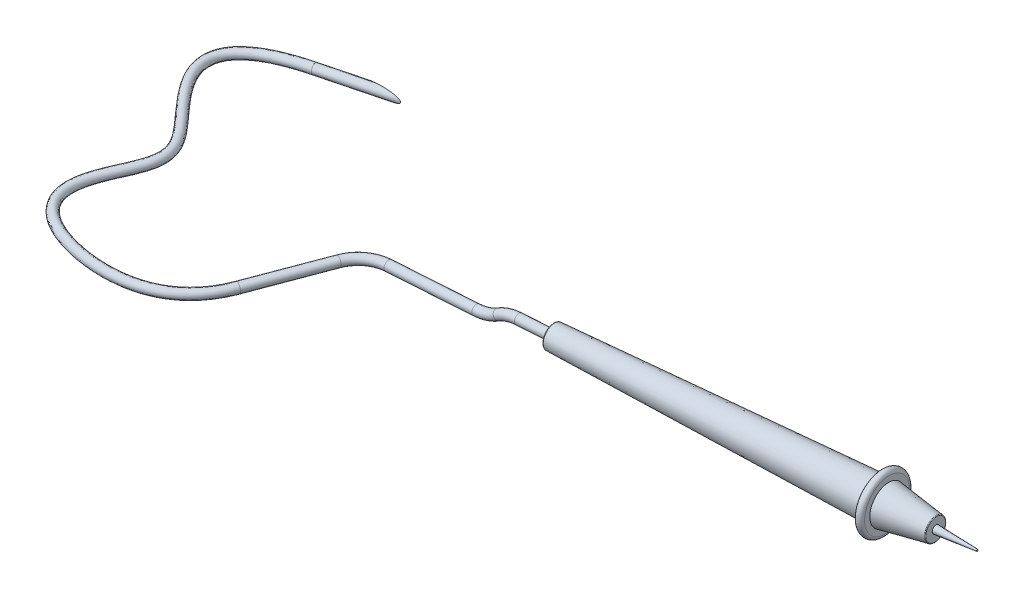
ISO-10303-21;
HEADER;
FILE_DESCRIPTION(('STEP AP214'),'2;1');
FILE_NAME('part.step','',(''),(''),'','','');
FILE_SCHEMA(('AUTOMOTIVE_DESIGN { 1 0 10303 214 1 1 1 1 }'));
ENDSEC;
DATA;
#1=APPLICATION_CONTEXT('core data for automotive mechanical design processes');
#2=APPLICATION_PROTOCOL_DEFINITION('international standard','automotive_design',2000,#1);
#3=PRODUCT_CONTEXT('',#1,'mechanical');
#4=PRODUCT('Part','Part','',(#3));
#5=PRODUCT_RELATED_PRODUCT_CATEGORY('part','',(#4));
#6=PRODUCT_DEFINITION_FORMATION('','',#4);
#7=PRODUCT_DEFINITION_CONTEXT('part definition',#1,'design');
#8=PRODUCT_DEFINITION('design','',#6,#7);
#9=PRODUCT_DEFINITION_SHAPE('','',#8);
#10=(LENGTH_UNIT() NAMED_UNIT(*) SI_UNIT(.MILLI.,.METRE.));
#11=(NAMED_UNIT(*) PLANE_ANGLE_UNIT() SI_UNIT($,.RADIAN.));
#12=(NAMED_UNIT(*) SI_UNIT($,.STERADIAN.) SOLID_ANGLE_UNIT());
#13=UNCERTAINTY_MEASURE_WITH_UNIT(LENGTH_MEASURE(1.E-05),#10,'distance_accuracy_value','');
#14=(GEOMETRIC_REPRESENTATION_CONTEXT(3) GLOBAL_UNCERTAINTY_ASSIGNED_CONTEXT((#13)) GLOBAL_UNIT_ASSIGNED_CONTEXT((#10,
#11,#12)) REPRESENTATION_CONTEXT('',''));
#15=CARTESIAN_POINT('',(0.,0.,0.));
#16=DIRECTION('',(0.,0.,1.));
#17=DIRECTION('',(1.,0.,0.));
#18=AXIS2_PLACEMENT_3D('',#15,#16,#17);
#19=CARTESIAN_POINT('',(-114.413181411453,1.84392445554634,46.2386150736062));
#20=DIRECTION('',(-0.968172758552491,0.,0.250282859175096));
#21=DIRECTION('',(-0.0433734577551862,0.984869477601442,-0.167782166070835));
#22=AXIS2_PLACEMENT_3D('',#19,#20,#21);
#23=CYLINDRICAL_SURFACE('',#22,1.25);
#24=CARTESIAN_POINT('',(-128.963400440303,1.84392445554635,50.));
#25=DIRECTION('',(0.,0.,1.));
#26=DIRECTION('',(-1.,0.,0.));
#27=AXIS2_PLACEMENT_3D('',#24,#25,#26);
#28=ELLIPSE('',#27,4.99434921000926,1.25);
#29=CARTESIAN_POINT('',(-133.957749650313,1.84392445554636,50.));
#30=VERTEX_POINT('',#29);
#31=EDGE_CURVE('P0_E44',#30,#30,#28,.F.);
#32=ORIENTED_EDGE('',*,*,#31,.F.);
#33=EDGE_LOOP('',(#32));
#34=FACE_BOUND('',#33,.T.);
#35=CARTESIAN_POINT('',(-143.104581010013,1.84392445554637,53.6556441748989));
#36=DIRECTION('',(-0.968172758552389,-2.30426060928425E-12,0.250282859175489));
#37=DIRECTION('',(-0.0433734577574522,0.984869477601442,-0.167782166070249));
#38=AXIS2_PLACEMENT_3D('',#35,#36,#37);
#39=CIRCLE('',#38,1.25);
#40=CARTESIAN_POINT('',(-143.050364187816,0.612837608544567,53.8653718824867));
#41=VERTEX_POINT('',#40);
#42=EDGE_CURVE('P0_E11',#41,#41,#39,.T.);
#43=ORIENTED_EDGE('',*,*,#42,.F.);
#44=EDGE_LOOP('',(#43));
#45=FACE_BOUND('',#44,.T.);
#46=ADVANCED_FACE('P0_F40',(#34,#45),#23,.T.);
#47=CARTESIAN_POINT('',(-143.104581010013,1.84392445554637,53.6556441748989));
#48=DIRECTION('',(0.968172758552389,2.30430844661795E-12,-0.250282859175489));
#49=DIRECTION('',(-0.0433734577574523,0.984869477601442,-0.167782166070249));
#50=AXIS2_PLACEMENT_3D('',#47,#48,#49);
#51=PLANE('',#50);
#52=ORIENTED_EDGE('',*,*,#42,.T.);
#53=EDGE_LOOP('',(#52));
#54=FACE_BOUND('',#53,.T.);
#55=ADVANCED_FACE('P0_F42',(#54),#51,.F.);
#56=CARTESIAN_POINT('',(0.,0.,50.));
#57=DIRECTION('',(0.,0.,1.));
#58=DIRECTION('',(1.,0.,0.));
#59=AXIS2_PLACEMENT_3D('',#56,#57,#58);
#60=PLANE('',#59);
#61=ORIENTED_EDGE('',*,*,#31,.T.);
#62=EDGE_LOOP('',(#61));
#63=FACE_BOUND('',#62,.T.);
#64=ADVANCED_FACE('P0_F52',(#63),#60,.F.);
#65=CLOSED_SHELL('',(#46,#55,#64));
#66=MANIFOLD_SOLID_BREP('P0_B2',#65);
#67=CARTESIAN_POINT('',(-58.2438068953792,2.11679684586519,84.3713220977987));
#68=DIRECTION('',(0.997004276211552,-0.00938755554240006,-0.0767746508739621));
#69=DIRECTION('',(0.0133912818415065,0.998567603527678,0.0518016868029478));
#70=AXIS2_PLACEMENT_3D('',#67,#68,#69);
#71=CYLINDRICAL_SURFACE('',#70,1.25);
#72=CARTESIAN_POINT('',(-49.8079475316261,2.03736679705334,83.7217158995836));
#73=DIRECTION('',(0.997004276211552,-0.00938755554240027,-0.0767746508739621));
#74=DIRECTION('',(0.0133912818415067,0.998567603527678,0.0518016868029478));
#75=AXIS2_PLACEMENT_3D('',#72,#73,#74);
#76=CIRCLE('',#75,1.25);
#77=CARTESIAN_POINT('',(-49.824686633928,0.789157292643739,83.6569637910799));
#78=VERTEX_POINT('',#77);
#79=EDGE_CURVE('P1_E41',#78,#78,#76,.T.);
#80=ORIENTED_EDGE('',*,*,#79,.F.);
#81=EDGE_LOOP('',(#80));
#82=FACE_BOUND('',#81,.T.);
#83=CARTESIAN_POINT('',(-58.2438068953792,2.11679684586519,84.3713220977987));
#84=DIRECTION('',(0.997004276211552,-0.00938755554240027,-0.0767746508739621));
#85=DIRECTION('',(0.0133912818415067,0.998567603527678,0.0518016868029478));
#86=AXIS2_PLACEMENT_3D('',#83,#84,#85);
#87=CIRCLE('',#86,1.25);
#88=CARTESIAN_POINT('',(-58.260545997681,0.868587341455588,84.306569989295));
#89=VERTEX_POINT('',#88);
#90=EDGE_CURVE('P1_E11',#89,#89,#87,.T.);
#91=ORIENTED_EDGE('',*,*,#90,.T.);
#92=EDGE_LOOP('',(#91));
#93=FACE_BOUND('',#92,.T.);
#94=ADVANCED_FACE('P1_F16',(#82,#93),#71,.T.);
#95=CARTESIAN_POINT('',(-58.3744194228826,-7.62278149498767,83.8660717922377));
#96=DIRECTION('',(-0.0761783879228338,0.052674614245647,-0.995701882205487));
#97=DIRECTION('',(0.0133912818415064,0.998567603527678,0.0518016868029479));
#98=AXIS2_PLACEMENT_3D('',#95,#96,#97);
#99=TOROIDAL_SURFACE('',#98,9.75354929044911,1.25);
#100=ORIENTED_EDGE('',*,*,#90,.F.);
#101=EDGE_LOOP('',(#100));
#102=FACE_BOUND('',#101,.T.);
#103=CARTESIAN_POINT('',(-63.3407344520195,0.731373282880699,84.6879822131526));
#104=DIRECTION('',(0.857281918810159,0.513411157712895,-0.0384277870437101));
#105=DIRECTION('',(-0.509180287221187,0.856524587008439,0.0842678287092573));
#106=AXIS2_PLACEMENT_3D('',#103,#104,#105);
#107=CIRCLE('',#106,1.25);
#108=CARTESIAN_POINT('',(-62.704259092993,-0.339282450879845,84.582647427266));
#109=VERTEX_POINT('',#108);
#110=EDGE_CURVE('P1_E29',#109,#109,#107,.T.);
#111=ORIENTED_EDGE('',*,*,#110,.T.);
#112=EDGE_LOOP('',(#111));
#113=FACE_BOUND('',#112,.T.);
#114=ADVANCED_FACE('P1_F18',(#102,#113),#99,.T.);
#115=CARTESIAN_POINT('',(-68.7548621074316,9.83882219723435,85.5840042967375));
#116=DIRECTION('',(0.0761783879228338,-0.052674614245647,0.995701882205487));
#117=DIRECTION('',(-0.0133912818415064,-0.998567603527678,-0.0518016868029479));
#118=AXIS2_PLACEMENT_3D('',#115,#116,#117);
#119=TOROIDAL_SURFACE('',#118,10.6330268301614,1.25);
#120=ORIENTED_EDGE('',*,*,#110,.F.);
#121=EDGE_LOOP('',(#120));
#122=FACE_BOUND('',#121,.T.);
#123=CARTESIAN_POINT('',(-68.8972519665426,-0.778973922805424,85.0331955711142));
#124=DIRECTION('',(0.997004276211552,-0.00938755554239999,-0.0767746508739621));
#125=DIRECTION('',(0.0133912818415064,0.998567603527678,0.0518016868029478));
#126=AXIS2_PLACEMENT_3D('',#123,#124,#125);
#127=CIRCLE('',#126,1.25);
#128=CARTESIAN_POINT('',(-68.9139910688445,-2.02718342721502,84.9684434626105));
#129=VERTEX_POINT('',#128);
#130=EDGE_CURVE('P1_E82',#129,#129,#127,.T.);
#131=ORIENTED_EDGE('',*,*,#130,.T.);
#132=EDGE_LOOP('',(#131));
#133=FACE_BOUND('',#132,.T.);
#134=ADVANCED_FACE('P1_F179',(#122,#133),#119,.T.);
#135=CARTESIAN_POINT('',(-49.8079475316261,2.03736679705334,83.7217158995836));
#136=DIRECTION('',(-0.997004276211552,0.00938755554240021,0.0767746508739621));
#137=DIRECTION('',(-0.0761783879228338,0.052674614245647,-0.995701882205487));
#138=AXIS2_PLACEMENT_3D('',#135,#136,#137);
#139=PLANE('',#138);
#140=ORIENTED_EDGE('',*,*,#79,.T.);
#141=EDGE_LOOP('',(#140));
#142=FACE_BOUND('',#141,.T.);
#143=ADVANCED_FACE('P1_F125',(#142),#139,.F.);
#144=CARTESIAN_POINT('',(-105.259920768685,-1.64879020422453,111.20345233921));
#145=CARTESIAN_POINT('',(-106.750688929774,-1.80611365168269,114.621514673474));
#146=CARTESIAN_POINT('',(-110.640430291664,-2.02501234830117,119.846706872232));
#147=CARTESIAN_POINT('',(-117.859534925365,-2.14078848651006,123.944707898293));
#148=CARTESIAN_POINT('',(-125.291825774411,-2.12039383053202,125.472890929166));
#149=CARTESIAN_POINT('',(-133.033123922986,-2.01230013553817,125.390404104827));
#150=CARTESIAN_POINT('',(-142.834844960721,-1.78205480638048,123.485873119425));
#151=CARTESIAN_POINT('',(-148.981271558803,-1.51249239346335,119.878504840365));
#152=CARTESIAN_POINT('',(-151.796055108792,-1.24593195233411,115.467739956934));
#153=CARTESIAN_POINT('',(-152.837293929922,-1.02075470408737,111.396228088316));
#154=CARTESIAN_POINT('',(-151.952367733216,-0.767819311691482,106.291695763973));
#155=CARTESIAN_POINT('',(-149.272820472082,-0.511082386092837,100.64995382176));
#156=CARTESIAN_POINT('',(-147.220348302442,-0.333998327474796,96.7057649363695));
#157=CARTESIAN_POINT('',(-146.025960211018,-0.163749915276623,93.1151687992));
#158=CARTESIAN_POINT('',(-145.91141669945,-0.0280019114081995,90.4687792351968));
#159=CARTESIAN_POINT('',(-147.580324466714,0.174216825129343,87.002091643789));
#160=CARTESIAN_POINT('',(-150.468601260601,0.398085075846043,83.4332917561691));
#161=CARTESIAN_POINT('',(-154.419184865753,0.673932366147242,79.1371229853099));
#162=CARTESIAN_POINT('',(-158.455370234701,0.985889364545348,74.1670057489098));
#163=CARTESIAN_POINT('',(-160.753449080808,1.26160537531215,69.4461777277364));
#164=CARTESIAN_POINT('',(-161.158512240234,1.46245178941384,65.679226890451));
#165=CARTESIAN_POINT('',(-160.292664263156,1.65774944641164,61.6906940768042));
#166=CARTESIAN_POINT('',(-156.231714180668,1.84852647005168,56.9633367740429));
#167=CARTESIAN_POINT('',(-148.738566025946,1.91099623696341,53.8220656243791));
#168=CARTESIAN_POINT('',(-143.417175582341,1.91099623697504,52.4464301262206));
#169=CARTESIAN_POINT('',(-105.2548794718,-1.27656707106977,111.222783417744));
#170=CARTESIAN_POINT('',(-106.745646087723,-1.43389035546381,114.640842209222));
#171=CARTESIAN_POINT('',(-110.635405745571,-1.6527898276703,119.866054088486));
#172=CARTESIAN_POINT('',(-117.854520070999,-1.76856611507036,123.964060495879));
#173=CARTESIAN_POINT('',(-125.286826252182,-1.74817167963204,125.492251741558));
#174=CARTESIAN_POINT('',(-133.028134147651,-1.64007786029896,125.409765040039));
#175=CARTESIAN_POINT('',(-142.829872645672,-1.40983226970072,123.505233528584));
#176=CARTESIAN_POINT('',(-148.976315947282,-1.14026890641912,119.897851247634));
#177=CARTESIAN_POINT('',(-151.79111184574,-0.873707355557576,115.487068164392));
#178=CARTESIAN_POINT('',(-152.832351077607,-0.648529898137863,111.415552369781));
#179=CARTESIAN_POINT('',(-151.947429320353,-0.395592759320405,106.31098752777));
#180=CARTESIAN_POINT('',(-149.267876091643,-0.138855592041411,100.669239384067));
#181=CARTESIAN_POINT('',(-147.215407971626,0.0382280307750147,96.7250599463803));
#182=CARTESIAN_POINT('',(-146.021020390592,0.208476225744522,93.1344681286125));
#183=CARTESIAN_POINT('',(-145.906475898889,0.344223216824249,90.4880978344975));
#184=CARTESIAN_POINT('',(-147.575378859627,0.546441006019273,87.0214272622267));
#185=CARTESIAN_POINT('',(-150.463651315557,0.770308786035715,83.4526353267654));
#186=CARTESIAN_POINT('',(-154.414236199442,1.04615629414252,79.1564626878902));
#187=CARTESIAN_POINT('',(-158.450423443693,1.35811351518801,74.18634164436));
#188=CARTESIAN_POINT('',(-160.748504835859,1.63383104401761,69.4654850180694));
#189=CARTESIAN_POINT('',(-161.153565389661,1.83467764272383,65.6985299486292));
#190=CARTESIAN_POINT('',(-160.287714531228,2.02997545919127,61.7099933160672));
#191=CARTESIAN_POINT('',(-156.226754639769,2.22075366451408,56.9826106985931));
#192=CARTESIAN_POINT('',(-148.733585750023,2.2832240462415,53.8413223370656));
#193=CARTESIAN_POINT('',(-143.412197380603,2.28322404625313,52.4656873751054));
#194=CARTESIAN_POINT('',(-105.573997849595,-0.520333175502154,111.118409021138));
#195=CARTESIAN_POINT('',(-107.045894058565,-0.675665031883269,114.493201375271));
#196=CARTESIAN_POINT('',(-110.872566026124,-0.89077080803716,119.628974332695));
#197=CARTESIAN_POINT('',(-117.967151664148,-1.0047137114456,123.659447097361));
#198=CARTESIAN_POINT('',(-125.308692292298,-0.984687072078076,125.171264400152));
#199=CARTESIAN_POINT('',(-132.97777439733,-0.877642516464973,125.090332953825));
#200=CARTESIAN_POINT('',(-142.705801316868,-0.649107622269081,123.199722870974));
#201=CARTESIAN_POINT('',(-148.732927561694,-0.383684260020333,119.641301593625));
#202=CARTESIAN_POINT('',(-151.445593240534,-0.12617457141549,115.378607159984));
#203=CARTESIAN_POINT('',(-152.452110229825,0.090840567935182,111.455458176017));
#204=CARTESIAN_POINT('',(-151.597654742651,0.337704825688736,106.475834529925));
#205=CARTESIAN_POINT('',(-148.942008457675,0.592500526815453,100.877691719637));
#206=CARTESIAN_POINT('',(-146.880716886654,0.770372292857698,96.9160384955296));
#207=CARTESIAN_POINT('',(-145.653449358239,0.944185630202624,93.2482225453587));
#208=CARTESIAN_POINT('',(-145.53038613442,1.08826711283225,90.4389882497608));
#209=CARTESIAN_POINT('',(-147.271921288984,1.29780812858802,86.8499259367986));
#210=CARTESIAN_POINT('',(-150.187296939239,1.52362096628664,83.2506460930878));
#211=CARTESIAN_POINT('',(-154.136622539198,1.79936586474019,78.9561258955685));
#212=CARTESIAN_POINT('',(-158.143919233729,2.10925549181917,74.0183928100742));
#213=CARTESIAN_POINT('',(-160.391896868028,2.37967343290763,69.386742604899));
#214=CARTESIAN_POINT('',(-160.777970276573,2.57337981059822,65.7525193362764));
#215=CARTESIAN_POINT('',(-159.950482492561,2.76015418720965,61.9382040893427));
#216=CARTESIAN_POINT('',(-156.036158069371,2.94583249353278,57.3470377080839));
#217=CARTESIAN_POINT('',(-148.608544511739,3.00841761516553,54.2204842794003));
#218=CARTESIAN_POINT('',(-143.312487206783,3.0084176151771,52.8513976645035));
#219=CARTESIAN_POINT('',(-106.68016984388,-0.202188919487146,110.650601742554));
#220=CARTESIAN_POINT('',(-108.088414204357,-0.350803481721973,113.879451896204));
#221=CARTESIAN_POINT('',(-111.702342827736,-0.553115411490692,118.713604818242));
#222=CARTESIAN_POINT('',(-118.376929403051,-0.660874859731917,122.516306547678));
#223=CARTESIAN_POINT('',(-125.412364648173,-0.642089305633732,123.972916460698));
#224=CARTESIAN_POINT('',(-132.837860358373,-0.53858350601432,123.897231040957));
#225=CARTESIAN_POINT('',(-142.317308536771,-0.315817976276195,122.053575268055));
#226=CARTESIAN_POINT('',(-147.942031372927,-0.0643560809573145,118.660260025707));
#227=CARTESIAN_POINT('',(-150.310252388309,0.162625309539789,114.897009056377));
#228=CARTESIAN_POINT('',(-151.199655681185,0.352110269346733,111.474277037481));
#229=CARTESIAN_POINT('',(-150.447970905159,0.578495613965307,106.915987369434));
#230=CARTESIAN_POINT('',(-147.872945637616,0.82674353809073,101.46490573081));
#231=CARTESIAN_POINT('',(-145.781903445845,1.00727255629477,97.4443385010211));
#232=CARTESIAN_POINT('',(-144.443736348039,1.1931102314322,93.5160638207203));
#233=CARTESIAN_POINT('',(-144.291937854654,1.36530063095953,90.1575528966201));
#234=CARTESIAN_POINT('',(-146.278442377415,1.59953982799563,86.1557173486498));
#235=CARTESIAN_POINT('',(-149.285223713342,1.83191199033917,82.4536244476548));
#236=CARTESIAN_POINT('',(-153.23030503394,2.10731133502341,78.1646682090715));
#237=CARTESIAN_POINT('',(-157.140161379982,2.41022772132118,73.3361671103245));
#238=CARTESIAN_POINT('',(-159.219150257796,2.66277442705894,69.0053306730365));
#239=CARTESIAN_POINT('',(-159.541175449123,2.83239799737841,65.8187882608845));
#240=CARTESIAN_POINT('',(-158.843075421134,2.9904240432598,62.5920951843651));
#241=CARTESIAN_POINT('',(-155.423313770128,3.15890381305979,58.4603101927751));
#242=CARTESIAN_POINT('',(-148.216760639643,3.22187746120094,55.3834136895372));
#243=CARTESIAN_POINT('',(-143.006147654012,3.22187746121233,54.0364153314644));
#244=CARTESIAN_POINT('',(-107.578343060504,-0.946231902689048,110.224622547539));
#245=CARTESIAN_POINT('',(-108.935538122043,-1.0894591405169,113.33642587228));
#246=CARTESIAN_POINT('',(-112.379575843183,-1.28154414468901,117.929518429119));
#247=CARTESIAN_POINT('',(-118.71793941829,-1.38435373728979,121.549885894461));
#248=CARTESIAN_POINT('',(-125.508584917694,-1.36656947657068,122.962516750283));
#249=CARTESIAN_POINT('',(-132.739210303109,-1.26589523713174,122.891038545314));
#250=CARTESIAN_POINT('',(-142.020028367069,-1.04774427462992,121.084988603844));
#251=CARTESIAN_POINT('',(-147.322845227502,-0.807439417152266,117.823528583088));
#252=CARTESIAN_POINT('',(-149.415464115945,-0.604884301107646,114.459890480882));
#253=CARTESIAN_POINT('',(-150.2110426541,-0.437451427982937,111.437996096788));
#254=CARTESIAN_POINT('',(-149.54184141481,-0.227420432475867,107.216287813698));
#255=CARTESIAN_POINT('',(-147.031227937693,0.0155886043159948,101.882845966081));
#256=CARTESIAN_POINT('',(-144.916474188911,0.198233171573463,97.8153681617297));
#257=CARTESIAN_POINT('',(-143.489464521477,0.3936985997623,93.6785350570205));
#258=CARTESIAN_POINT('',(-143.31461130407,0.588379760948746,89.8805156982779));
#259=CARTESIAN_POINT('',(-145.497248195111,0.842378901002124,85.5484751670643));
#260=CARTESIAN_POINT('',(-148.577133331867,1.07999206736819,81.7642509014586));
#261=CARTESIAN_POINT('',(-152.518853759461,1.35512132295635,77.4796322736718));
#262=CARTESIAN_POINT('',(-156.35069428838,1.65245732529241,72.7385348701259));
#263=CARTESIAN_POINT('',(-158.294359962611,1.89073197299089,68.6478346987114));
#264=CARTESIAN_POINT('',(-158.56498522172,2.0410649040559,65.8198654832689));
#265=CARTESIAN_POINT('',(-157.9704675797,2.17606126882831,63.0638867001292));
#266=CARTESIAN_POINT('',(-154.946669577441,2.33079750064914,59.2993930802582));
#267=CARTESIAN_POINT('',(-147.916595429138,2.39410161296689,56.2617479816387));
#268=CARTESIAN_POINT('',(-142.774509480869,2.39410161297813,54.9324645847547));
#269=CARTESIAN_POINT('',(-107.598394212266,-2.1858177590921,110.158822829162));
#270=CARTESIAN_POINT('',(-108.955584758566,-2.32904452041866,113.270615801275));
#271=CARTESIAN_POINT('',(-112.39858114815,-2.52108110441582,117.862505779854));
#272=CARTESIAN_POINT('',(-118.736044987448,-2.62387716609383,121.48237982194));
#273=CARTESIAN_POINT('',(-125.525673040689,-2.60608466410751,122.894588792451));
#274=CARTESIAN_POINT('',(-132.755596121521,-2.50541987249996,122.823111157728));
#275=CARTESIAN_POINT('',(-142.035368814028,-2.28728688201898,121.017137418681));
#276=CARTESIAN_POINT('',(-147.336999150051,-2.04703941277345,117.756476926843));
#277=CARTESIAN_POINT('',(-149.428687677092,-1.84456742358397,114.394200731114));
#278=CARTESIAN_POINT('',(-150.224115578929,-1.67717488727923,111.373044968301));
#279=CARTESIAN_POINT('',(-149.554836563193,-1.46724348551521,107.153236421785));
#280=CARTESIAN_POINT('',(-147.044575458688,-1.22425243816647,101.820232444004));
#281=CARTESIAN_POINT('',(-144.929610862673,-1.04158579718495,97.7522746240006));
#282=CARTESIAN_POINT('',(-143.502453239251,-0.846097245178664,93.6149575193127));
#283=CARTESIAN_POINT('',(-143.327610344468,-0.651339938531372,89.8154729928917));
#284=CARTESIAN_POINT('',(-145.51073499733,-0.397271379630211,85.4822203842281));
#285=CARTESIAN_POINT('',(-148.590913438415,-0.159630192587443,81.6975317936064));
#286=CARTESIAN_POINT('',(-152.532573121616,0.115489143950635,77.4130886696949));
#287=CARTESIAN_POINT('',(-156.364221235337,0.412807507438282,72.6722815442726));
#288=CARTESIAN_POINT('',(-158.307584101295,0.650995504664945,68.5831734322704));
#289=CARTESIAN_POINT('',(-158.578250784435,0.801293078887071,65.7558964900139));
#290=CARTESIAN_POINT('',(-157.984005756726,0.936249901090788,63.0007504323275));
#291=CARTESIAN_POINT('',(-154.961197086536,1.09091495895757,59.237884566966));
#292=CARTESIAN_POINT('',(-147.932280385038,1.15419261716451,56.2010486295343));
#293=CARTESIAN_POINT('',(-142.79020049789,1.15419261717574,54.8717667995138));
#294=CARTESIAN_POINT('',(-106.716088338112,-2.99082892466173,110.506583126511));
#295=CARTESIAN_POINT('',(-108.124312703031,-3.13944137672921,113.735387433952));
#296=CARTESIAN_POINT('',(-111.738734472039,-3.3417752131119,118.570090127415));
#297=CARTESIAN_POINT('',(-118.413663800591,-3.44953986280483,122.372980729202));
#298=CARTESIAN_POINT('',(-125.449546215599,-3.43075924353667,123.82980136778));
#299=CARTESIAN_POINT('',(-132.875339195623,-3.32724953726593,123.754117487922));
#300=CARTESIAN_POINT('',(-142.355270079657,-3.10447623664281,121.91043670219));
#301=CARTESIAN_POINT('',(-147.980498366249,-2.85298795320442,118.516743447209));
#302=CARTESIAN_POINT('',(-150.349105505094,-2.62597197563978,114.752925568984));
#303=CARTESIAN_POINT('',(-151.238549670785,-2.43647471963492,111.329967085542));
#304=CARTESIAN_POINT('',(-150.486943596432,-2.21004225676059,106.770789476381));
#305=CARTESIAN_POINT('',(-147.911754500637,-1.96178682690375,101.319520800401));
#306=CARTESIAN_POINT('',(-145.820816862041,-1.78126891581206,97.2991947076174));
#307=CARTESIAN_POINT('',(-144.482691367139,-1.59543961563513,93.3710922240347));
#308=CARTESIAN_POINT('',(-144.330877101985,-1.42328084738875,90.0131869707176));
#309=CARTESIAN_POINT('',(-146.317201909978,-1.18907081466656,86.0118671574578));
#310=CARTESIAN_POINT('',(-149.323855454096,-0.956711627607549,82.3099913421085));
#311=CARTESIAN_POINT('',(-153.268968422808,-0.68130699243698,78.0209413015713));
#312=CARTESIAN_POINT('',(-157.178895380339,-0.378383441836236,73.1923203522387));
#313=CARTESIAN_POINT('',(-159.25798986095,-0.125795760338207,68.8607213353442));
#314=CARTESIAN_POINT('',(-159.579969849707,0.0438386052059809,65.6739591411213));
#315=CARTESIAN_POINT('',(-158.881766721435,0.201876084074833,62.4470190213754));
#316=CARTESIAN_POINT('',(-155.461639737784,0.370388622101434,58.3145079228909));
#317=CARTESIAN_POINT('',(-148.254533037054,0.433376842242716,55.2371874152665));
#318=CARTESIAN_POINT('',(-143.043946892857,0.433376842254102,53.8901959959874));
#319=CARTESIAN_POINT('',(-105.604245630907,-2.75367197443067,111.002422549932));
#320=CARTESIAN_POINT('',(-107.076151110872,-2.90900480919657,114.377236160783));
#321=CARTESIAN_POINT('',(-110.902713302681,-3.12410593182242,119.512891035173));
#322=CARTESIAN_POINT('',(-117.997240790349,-3.23804794008377,123.543331511842));
#323=CARTESIAN_POINT('',(-125.338689425673,-3.21801997747792,125.055099525798));
#324=CARTESIAN_POINT('',(-133.007713049339,-3.11097616790025,124.974167342553));
#325=CARTESIAN_POINT('',(-142.735635207161,-2.88244284234766,123.083560416022));
#326=CARTESIAN_POINT('',(-148.762661230816,-2.61702518228567,119.525223150011));
#327=CARTESIAN_POINT('',(-151.475252818848,-2.35952215207472,115.262637915237));
#328=CARTESIAN_POINT('',(-152.481767343715,-2.14250826776187,111.339512487227));
#329=CARTESIAN_POINT('',(-151.627285219827,-1.89565448853772,106.360083947143));
#330=CARTESIAN_POINT('',(-148.971674740311,-1.64086023749311,100.761978345797));
#331=CARTESIAN_POINT('',(-146.910358871553,-1.46298585664116,96.8002684354646));
#332=CARTESIAN_POINT('',(-145.683088280795,-1.28917121592425,93.132426568884));
#333=CARTESIAN_POINT('',(-145.560030937787,-1.14508365656245,90.3230766539567));
#334=CARTESIAN_POINT('',(-147.301594931506,-0.935536956751566,86.7339122261722));
#335=CARTESIAN_POINT('',(-150.216996609502,-0.709721294851381,83.1345846695098));
#336=CARTESIAN_POINT('',(-154.166314537062,-0.433977703231503,78.8400876800865));
#337=CARTESIAN_POINT('',(-158.17359997978,-0.124089412036826,73.902377437373));
#338=CARTESIAN_POINT('',(-160.42156233772,0.146319420674868,69.2708988629012));
#339=CARTESIAN_POINT('',(-160.807651380016,0.340024690738276,65.6367009872078));
#340=CARTESIAN_POINT('',(-159.98018088413,0.526798110531887,61.8224086537646));
#341=CARTESIAN_POINT('',(-156.065915314766,0.712469326758402,57.2313941607828));
#342=CARTESIAN_POINT('',(-148.638426167275,0.775050759497007,54.1049440032816));
#343=CARTESIAN_POINT('',(-143.342356417215,0.775050759508577,52.7358541711944));
#344=CARTESIAN_POINT('',(-105.26496206557,-2.02101333737928,111.184121260676));
#345=CARTESIAN_POINT('',(-106.755731771825,-2.17833694790157,114.602187137726));
#346=CARTESIAN_POINT('',(-110.645454837757,-2.39723486893205,119.827359655979));
#347=CARTESIAN_POINT('',(-117.864549779732,-2.51301085794975,123.925355300707));
#348=CARTESIAN_POINT('',(-125.29682529664,-2.49261598143199,125.453530116774));
#349=CARTESIAN_POINT('',(-133.03811369832,-2.38452241077738,125.371043169615));
#350=CARTESIAN_POINT('',(-142.839817275769,-2.15427734306024,123.466512710266));
#351=CARTESIAN_POINT('',(-148.986227170323,-1.88471588050757,119.859158433096));
#352=CARTESIAN_POINT('',(-151.800998371845,-1.61815654911065,115.448411749476));
#353=CARTESIAN_POINT('',(-152.842236782237,-1.39297951003688,111.376903806851));
#354=CARTESIAN_POINT('',(-151.957306146079,-1.14004586406255,106.272404000176));
#355=CARTESIAN_POINT('',(-149.277764852521,-0.883309180144266,100.630668259453));
#356=CARTESIAN_POINT('',(-147.225288633259,-0.706224685724605,96.6864699263586));
#357=CARTESIAN_POINT('',(-146.030900031444,-0.535976056297769,93.0958694697876));
#358=CARTESIAN_POINT('',(-145.916357500011,-0.40022703964065,90.4494606358961));
#359=CARTESIAN_POINT('',(-147.585270073801,-0.198007355760587,86.9827560253513));
#360=CARTESIAN_POINT('',(-150.473551205645,0.025861365656375,83.4139481855727));
#361=CARTESIAN_POINT('',(-154.424133532063,0.301708438151959,79.1177832827295));
#362=CARTESIAN_POINT('',(-158.46031702571,0.613665213902682,74.1476698534595));
#363=CARTESIAN_POINT('',(-160.758393325757,0.889379706606693,69.4268704374035));
#364=CARTESIAN_POINT('',(-161.163459090808,1.09022593610385,65.659923832273));
#365=CARTESIAN_POINT('',(-160.297613995084,1.28552343363201,61.6713948375412));
#366=CARTESIAN_POINT('',(-156.236673721567,1.47629927558929,56.9440628494926));
#367=CARTESIAN_POINT('',(-148.743546301869,1.53876842768533,53.8028089116926));
#368=CARTESIAN_POINT('',(-143.42215378408,1.53876842769695,52.4271728773358));
#369=CARTESIAN_POINT('',(-105.259920768685,-1.64879020422453,111.20345233921));
#370=CARTESIAN_POINT('',(-106.750688929774,-1.80611365168269,114.621514673474));
#371=CARTESIAN_POINT('',(-110.640430291664,-2.02501234830117,119.846706872232));
#372=CARTESIAN_POINT('',(-117.859534925365,-2.14078848651006,123.944707898293));
#373=CARTESIAN_POINT('',(-125.291825774411,-2.12039383053202,125.472890929166));
#374=CARTESIAN_POINT('',(-133.033123922986,-2.01230013553817,125.390404104827));
#375=CARTESIAN_POINT('',(-142.834844960721,-1.78205480638048,123.485873119425));
#376=CARTESIAN_POINT('',(-148.981271558803,-1.51249239346335,119.878504840365));
#377=CARTESIAN_POINT('',(-151.796055108792,-1.24593195233411,115.467739956934));
#378=CARTESIAN_POINT('',(-152.837293929922,-1.02075470408737,111.396228088316));
#379=CARTESIAN_POINT('',(-151.952367733216,-0.767819311691482,106.291695763973));
#380=CARTESIAN_POINT('',(-149.272820472082,-0.511082386092837,100.64995382176));
#381=CARTESIAN_POINT('',(-147.220348302442,-0.333998327474796,96.7057649363695));
#382=CARTESIAN_POINT('',(-146.025960211018,-0.163749915276623,93.1151687992));
#383=CARTESIAN_POINT('',(-145.91141669945,-0.0280019114081995,90.4687792351968));
#384=CARTESIAN_POINT('',(-147.580324466714,0.174216825129343,87.002091643789));
#385=CARTESIAN_POINT('',(-150.468601260601,0.398085075846043,83.4332917561691));
#386=CARTESIAN_POINT('',(-154.419184865753,0.673932366147242,79.1371229853099));
#387=CARTESIAN_POINT('',(-158.455370234701,0.985889364545348,74.1670057489098));
#388=CARTESIAN_POINT('',(-160.753449080808,1.26160537531215,69.4461777277364));
#389=CARTESIAN_POINT('',(-161.158512240234,1.46245178941384,65.679226890451));
#390=CARTESIAN_POINT('',(-160.292664263156,1.65774944641164,61.6906940768042));
#391=CARTESIAN_POINT('',(-156.231714180668,1.84852647005168,56.9633367740429));
#392=CARTESIAN_POINT('',(-148.738566025946,1.91099623696341,53.8220656243791));
#393=CARTESIAN_POINT('',(-143.417175582341,1.91099623697504,52.4464301262206));
#394=(BOUNDED_SURFACE() B_SPLINE_SURFACE(3,3,((#144,#145,#146,#147,#148,#149,#150,#151,#152,
#153,#154,#155,#156,#157,#158,#159,#160,#161,#162,#163,#164,#165,#166,#167,#168),(#169,#170,
#171,#172,#173,#174,#175,#176,#177,#178,#179,#180,#181,#182,#183,#184,#185,#186,#187,#188,#189,
#190,#191,#192,#193),(#194,#195,#196,#197,#198,#199,#200,#201,#202,#203,#204,#205,#206,#207,
#208,#209,#210,#211,#212,#213,#214,#215,#216,#217,#218),(#219,#220,#221,#222,#223,#224,#225,
#226,#227,#228,#229,#230,#231,#232,#233,#234,#235,#236,#237,#238,#239,#240,#241,#242,#243),
(#244,#245,#246,#247,#248,#249,#250,#251,#252,#253,#254,#255,#256,#257,#258,#259,#260,#261,#262,
#263,#264,#265,#266,#267,#268),(#269,#270,#271,#272,#273,#274,#275,#276,#277,#278,#279,#280,
#281,#282,#283,#284,#285,#286,#287,#288,#289,#290,#291,#292,#293),(#294,#295,#296,#297,#298,
#299,#300,#301,#302,#303,#304,#305,#306,#307,#308,#309,#310,#311,#312,#313,#314,#315,#316,#317,
#318),(#319,#320,#321,#322,#323,#324,#325,#326,#327,#328,#329,#330,#331,#332,#333,#334,#335,
#336,#337,#338,#339,#340,#341,#342,#343),(#344,#345,#346,#347,#348,#349,#350,#351,#352,#353,
#354,#355,#356,#357,#358,#359,#360,#361,#362,#363,#364,#365,#366,#367,#368),(#369,#370,#371,
#372,#373,#374,#375,#376,#377,#378,#379,#380,#381,#382,#383,#384,#385,#386,#387,#388,#389,#390,
#391,#392,#393)),.UNSPECIFIED.,.T.,.F.,.F.) B_SPLINE_SURFACE_WITH_KNOTS((4,1,1,1,1,1,1,4),(4,1,
1,1,1,1,1,1,1,1,1,1,1,1,1,1,1,1,1,1,1,1,4),(-3.14159265358979,-2.24399475256414,
-1.34639685153848,-0.448798950512828,0.448798950512827,1.34639685153848,2.24399475256414,
3.14159265358979),(1.,1.17857142857143,1.35714285714286,1.53571428571429,1.71428571428571,
1.95238095238095,2.42857142857143,2.60714285714286,2.78571428571429,3.14285714285714,3.5,
3.85714285714286,3.97619047619048,4.33333333333333,4.57142857142857,4.80952380952381,
5.04761904761905,5.28571428571429,5.46428571428571,5.55357142857143,5.64285714285714,
5.82142857142857,6.),
.UNSPECIFIED.) GEOMETRIC_REPRESENTATION_ITEM() RATIONAL_B_SPLINE_SURFACE(((1.,1.,1.,1.,1.,1.,1.,
1.,1.,1.,1.,1.,1.,1.,1.,1.,1.,1.,1.,1.,1.,1.,1.,1.,1.),(1.,1.,1.,1.,1.,1.,1.,1.,1.,1.,1.,1.,1.,
1.,1.,1.,1.,1.,1.,1.,1.,1.,1.,1.,1.),(1.,1.,1.,1.,1.,1.,1.,1.,1.,1.,1.,1.,1.,1.,1.,1.,1.,1.,1.,
1.,1.,1.,1.,1.,1.),(1.,1.,1.,1.,1.,1.,1.,1.,1.,1.,1.,1.,1.,1.,1.,1.,1.,1.,1.,1.,1.,1.,1.,1.,1.),
(1.,1.,1.,1.,1.,1.,1.,1.,1.,1.,1.,1.,1.,1.,1.,1.,1.,1.,1.,1.,1.,1.,1.,1.,1.),(1.,1.,1.,1.,1.,1.,
1.,1.,1.,1.,1.,1.,1.,1.,1.,1.,1.,1.,1.,1.,1.,1.,1.,1.,1.),(1.,1.,1.,1.,1.,1.,1.,1.,1.,1.,1.,1.,
1.,1.,1.,1.,1.,1.,1.,1.,1.,1.,1.,1.,1.),(1.,1.,1.,1.,1.,1.,1.,1.,1.,1.,1.,1.,1.,1.,1.,1.,1.,1.,
1.,1.,1.,1.,1.,1.,1.),(1.,1.,1.,1.,1.,1.,1.,1.,1.,1.,1.,1.,1.,1.,1.,1.,1.,1.,1.,1.,1.,1.,1.,1.,
1.),(1.,1.,1.,1.,1.,1.,1.,1.,1.,1.,1.,1.,1.,1.,1.,1.,1.,1.,1.,1.,1.,1.,1.,1.,1.))) REPRESENTATION_ITEM('') SURFACE());
#395=CARTESIAN_POINT('',(-105.259920768685,-1.64879020422453,111.20345233921));
#396=CARTESIAN_POINT('',(-105.2548794718,-1.27656707106977,111.222783417744));
#397=CARTESIAN_POINT('',(-105.573997849595,-0.520333175502154,111.118409021138));
#398=CARTESIAN_POINT('',(-106.68016984388,-0.202188919487146,110.650601742554));
#399=CARTESIAN_POINT('',(-107.578343060504,-0.946231902689048,110.224622547539));
#400=CARTESIAN_POINT('',(-107.598394212266,-2.1858177590921,110.158822829162));
#401=CARTESIAN_POINT('',(-106.716088338112,-2.99082892466173,110.506583126511));
#402=CARTESIAN_POINT('',(-105.604245630907,-2.75367197443067,111.002422549932));
#403=CARTESIAN_POINT('',(-105.26496206557,-2.02101333737928,111.184121260676));
#404=CARTESIAN_POINT('',(-105.259920768685,-1.64879020422453,111.20345233921));
#405=(BOUNDED_CURVE() B_SPLINE_CURVE(3,(#395,#396,#397,#398,#399,#400,#401,#402,#403,#404),
.UNSPECIFIED.,.T.,.F.) B_SPLINE_CURVE_WITH_KNOTS((4,1,1,1,1,1,1,4),(-3.14159265358979,
-2.24399475256414,-1.34639685153848,-0.448798950512828,0.448798950512827,1.34639685153848,
2.24399475256414,3.14159265358979),
.UNSPECIFIED.) CURVE() GEOMETRIC_REPRESENTATION_ITEM() RATIONAL_B_SPLINE_CURVE((1.,1.,1.,1.,1.,
1.,1.,1.,1.,1.)) REPRESENTATION_ITEM(''));
#406=CARTESIAN_POINT('',(-105.260623850679,-1.64891512397539,111.203139944299));
#407=VERTEX_POINT('',#406);
#408=EDGE_CURVE('P1_E93',#407,#407,#405,.T.);
#409=CARTESIAN_POINT('',(-105.259920768685,-1.64879020422453,111.20345233921));
#410=CARTESIAN_POINT('',(-106.750688929774,-1.80611365168269,114.621514673474));
#411=CARTESIAN_POINT('',(-110.640430291664,-2.02501234830117,119.846706872232));
#412=CARTESIAN_POINT('',(-117.859534925365,-2.14078848651006,123.944707898293));
#413=CARTESIAN_POINT('',(-125.291825774411,-2.12039383053202,125.472890929166));
#414=CARTESIAN_POINT('',(-133.033123922986,-2.01230013553817,125.390404104827));
#415=CARTESIAN_POINT('',(-142.834844960721,-1.78205480638048,123.485873119425));
#416=CARTESIAN_POINT('',(-148.981271558803,-1.51249239346335,119.878504840365));
#417=CARTESIAN_POINT('',(-151.796055108792,-1.24593195233411,115.467739956934));
#418=CARTESIAN_POINT('',(-152.837293929922,-1.02075470408737,111.396228088316));
#419=CARTESIAN_POINT('',(-151.952367733216,-0.767819311691482,106.291695763973));
#420=CARTESIAN_POINT('',(-149.272820472082,-0.511082386092837,100.64995382176));
#421=CARTESIAN_POINT('',(-147.220348302442,-0.333998327474796,96.7057649363695));
#422=CARTESIAN_POINT('',(-146.025960211018,-0.163749915276623,93.1151687992));
#423=CARTESIAN_POINT('',(-145.91141669945,-0.0280019114081995,90.4687792351968));
#424=CARTESIAN_POINT('',(-147.580324466714,0.174216825129343,87.002091643789));
#425=CARTESIAN_POINT('',(-150.468601260601,0.398085075846043,83.4332917561691));
#426=CARTESIAN_POINT('',(-154.419184865753,0.673932366147242,79.1371229853099));
#427=CARTESIAN_POINT('',(-158.455370234701,0.985889364545348,74.1670057489098));
#428=CARTESIAN_POINT('',(-160.753449080808,1.26160537531215,69.4461777277364));
#429=CARTESIAN_POINT('',(-161.158512240234,1.46245178941384,65.679226890451));
#430=CARTESIAN_POINT('',(-160.292664263156,1.65774944641164,61.6906940768042));
#431=CARTESIAN_POINT('',(-156.231714180668,1.84852647005168,56.9633367740429));
#432=CARTESIAN_POINT('',(-148.738566025946,1.91099623696341,53.8220656243791));
#433=CARTESIAN_POINT('',(-143.417175582341,1.91099623697504,52.4464301262206));
#434=(BOUNDED_CURVE() B_SPLINE_CURVE(3,(#409,#410,#411,#412,#413,#414,#415,#416,#417,#418,#419,
#420,#421,#422,#423,#424,#425,#426,#427,#428,#429,#430,#431,#432,#433),.UNSPECIFIED.,.F.,
.F.) B_SPLINE_CURVE_WITH_KNOTS((4,1,1,1,1,1,1,1,1,1,1,1,1,1,1,1,1,1,1,1,1,1,4),(1.,
1.17857142857143,1.35714285714286,1.53571428571429,1.71428571428571,1.95238095238095,
2.42857142857143,2.60714285714286,2.78571428571429,3.14285714285714,3.5,3.85714285714286,
3.97619047619048,4.33333333333333,4.57142857142857,4.80952380952381,5.04761904761905,
5.28571428571429,5.46428571428571,5.55357142857143,5.64285714285714,5.82142857142857,6.),
.UNSPECIFIED.) CURVE() GEOMETRIC_REPRESENTATION_ITEM() RATIONAL_B_SPLINE_CURVE((1.,1.,1.,1.,1.,
1.,1.,1.,1.,1.,1.,1.,1.,1.,1.,1.,1.,1.,1.,1.,1.,1.,1.,1.,1.)) REPRESENTATION_ITEM(''));
#435=CARTESIAN_POINT('',(-143.416986453627,1.91080519347188,52.4471617357643));
#436=VERTEX_POINT('',#435);
#437=EDGE_CURVE('P1_E96',#407,#436,#434,.T.);
#438=CARTESIAN_POINT('',(-143.417175582571,1.91099623697504,52.44643012628));
#439=CARTESIAN_POINT('',(-143.42215378431,1.53876842769695,52.4271728773952));
#440=CARTESIAN_POINT('',(-143.342356417443,0.775050759508577,52.7358541712535));
#441=CARTESIAN_POINT('',(-143.043946893082,0.433376842254102,53.8901959960455));
#442=CARTESIAN_POINT('',(-142.790200498112,1.15419261717574,54.8717667995712));
#443=CARTESIAN_POINT('',(-142.774509481091,2.39410161297813,54.9324645848121));
#444=CARTESIAN_POINT('',(-143.006147654237,3.22187746121233,54.0364153315226));
#445=CARTESIAN_POINT('',(-143.312487207011,3.0084176151771,52.8513976645626));
#446=CARTESIAN_POINT('',(-143.412197380832,2.28322404625313,52.4656873751648));
#447=CARTESIAN_POINT('',(-143.417175582571,1.91099623697504,52.44643012628));
#448=(BOUNDED_CURVE() B_SPLINE_CURVE(3,(#438,#439,#440,#441,#442,#443,#444,#445,#446,#447),
.UNSPECIFIED.,.T.,.F.) B_SPLINE_CURVE_WITH_KNOTS((4,1,1,1,1,1,1,4),(-3.14159265358979,
-2.24399475256414,-1.34639685153848,-0.448798950512827,0.448798950512828,1.34639685153848,
2.24399475256414,3.14159265358979),
.UNSPECIFIED.) CURVE() GEOMETRIC_REPRESENTATION_ITEM() RATIONAL_B_SPLINE_CURVE((1.,1.,1.,1.,1.,
1.,1.,1.,1.,1.)) REPRESENTATION_ITEM(''));
#449=EDGE_CURVE('P1_E57',#436,#436,#448,.F.);
#450=ORIENTED_EDGE('',*,*,#408,.T.);
#451=ORIENTED_EDGE('',*,*,#437,.T.);
#452=ORIENTED_EDGE('',*,*,#449,.F.);
#453=ORIENTED_EDGE('',*,*,#437,.F.);
#454=EDGE_LOOP('',(#450,#451,#452,#453));
#455=FACE_BOUND('',#454,.T.);
#456=ADVANCED_FACE('P1_F112',(#455),#394,.T.);
#457=CARTESIAN_POINT('',(2799.62512502897,-106.079756158297,1373.34564766047));
#458=DIRECTION('',(0.0133912818415064,0.998567603527678,0.0518016868029478));
#459=DIRECTION('',(0.997004276211552,-0.0093875555424,-0.076774650873962));
#460=AXIS2_PLACEMENT_3D('',#457,#458,#459);
#461=TOROIDAL_SURFACE('',#460,3170.20420042437,1.25);
#462=ORIENTED_EDGE('',*,*,#408,.F.);
#463=EDGE_LOOP('',(#462));
#464=FACE_BOUND('',#463,.T.);
#465=CARTESIAN_POINT('',(-98.2457385397062,-0.754921210531863,92.1564307173595));
#466=DIRECTION('',(-0.405276748409125,-0.0419398324422729,0.913231519196333));
#467=DIRECTION('',(-0.914095963654566,0.0332233598497117,-0.40413460330777));
#468=AXIS2_PLACEMENT_3D('',#465,#466,#467);
#469=CIRCLE('',#468,1.25);
#470=CARTESIAN_POINT('',(-97.103118585138,-0.796450410344002,92.6615989714942));
#471=VERTEX_POINT('',#470);
#472=EDGE_CURVE('P1_E68',#471,#471,#469,.T.);
#473=ORIENTED_EDGE('',*,*,#472,.T.);
#474=EDGE_LOOP('',(#473));
#475=FACE_BOUND('',#474,.T.);
#476=ADVANCED_FACE('P1_F124',(#464,#475),#461,.T.);
#477=CARTESIAN_POINT('',(-89.8109972366323,-1.06148688491783,95.8855477532702));
#478=DIRECTION('',(0.0133912818415064,0.998567603527678,0.0518016868029478));
#479=DIRECTION('',(0.997004276211552,-0.0093875555424,-0.076774650873962));
#480=AXIS2_PLACEMENT_3D('',#477,#478,#479);
#481=TOROIDAL_SURFACE('',#480,9.22741335532405,1.25);
#482=ORIENTED_EDGE('',*,*,#472,.F.);
#483=EDGE_LOOP('',(#482));
#484=FACE_BOUND('',#483,.T.);
#485=CARTESIAN_POINT('',(-90.5139267107385,-0.575436445941004,86.697794907486));
#486=DIRECTION('',(-0.997004276211552,0.00938755554239999,0.0767746508739621));
#487=DIRECTION('',(-0.0761783879228338,0.052674614245647,-0.995701882205487));
#488=AXIS2_PLACEMENT_3D('',#485,#486,#487);
#489=CIRCLE('',#488,1.25);
#490=CARTESIAN_POINT('',(-90.418703725835,-0.641279713748063,87.9424222602429));
#491=VERTEX_POINT('',#490);
#492=EDGE_CURVE('P1_E166',#491,#491,#489,.T.);
#493=ORIENTED_EDGE('',*,*,#492,.T.);
#494=EDGE_LOOP('',(#493));
#495=FACE_BOUND('',#494,.T.);
#496=ADVANCED_FACE('P1_F140',(#484,#495),#481,.T.);
#497=CARTESIAN_POINT('',(-79.9135545429433,-0.675247033387446,85.8815096700656));
#498=DIRECTION('',(-0.997004276211552,0.00938755554239999,0.0767746508739621));
#499=DIRECTION('',(-0.0761783879228338,0.052674614245647,-0.995701882205487));
#500=AXIS2_PLACEMENT_3D('',#497,#498,#499);
#501=CYLINDRICAL_SURFACE('',#500,1.25);
#502=ORIENTED_EDGE('',*,*,#130,.F.);
#503=EDGE_LOOP('',(#502));
#504=FACE_BOUND('',#503,.T.);
#505=ORIENTED_EDGE('',*,*,#492,.F.);
#506=EDGE_LOOP('',(#505));
#507=FACE_BOUND('',#506,.T.);
#508=ADVANCED_FACE('P1_F83',(#504,#507),#501,.T.);
#509=CARTESIAN_POINT('',(-143.104581010013,1.84392445557564,53.6556441748998));
#510=DIRECTION('',(0.968172758552388,2.11441801567513E-12,-0.250282859175492));
#511=DIRECTION('',(-0.0133912818415064,-0.998567603527678,-0.0518016868029478));
#512=AXIS2_PLACEMENT_3D('',#509,#510,#511);
#513=PLANE('',#512);
#514=ORIENTED_EDGE('',*,*,#449,.T.);
#515=EDGE_LOOP('',(#514));
#516=FACE_BOUND('',#515,.T.);
#517=ADVANCED_FACE('P1_F135',(#516),#513,.T.);
#518=CLOSED_SHELL('',(#94,#114,#134,#143,#456,#476,#496,#508,#517));
#519=MANIFOLD_SOLID_BREP('P1_B1',#518);
#520=CARTESIAN_POINT('',(-49.6085466763837,2.03548928594452,83.7063609694082));
#521=DIRECTION('',(-0.997004276211551,0.00938755554240313,0.0767746508739619));
#522=DIRECTION('',(0.0667418186883583,0.606064040935442,0.792610817440169));
#523=AXIS2_PLACEMENT_3D('',#520,#521,#522);
#524=TOROIDAL_SURFACE('',#523,2.8049002995662,0.2);
#525=CARTESIAN_POINT('',(-49.6134921300942,2.03553585116244,83.7067417957407));
#526=DIRECTION('',(-0.997004276211551,0.00938755554240313,0.0767746508739619));
#527=DIRECTION('',(-0.0667418186883583,-0.606064040935442,-0.792610817440169));
#528=AXIS2_PLACEMENT_3D('',#525,#526,#527);
#529=CIRCLE('',#528,3.0048387783305);
#530=CARTESIAN_POINT('',(-49.4129437251631,3.85666058351694,86.0884095161092));
#531=VERTEX_POINT('',#530);
#532=EDGE_CURVE('P2_E11',#531,#531,#529,.T.);
#533=ORIENTED_EDGE('',*,*,#532,.T.);
#534=EDGE_LOOP('',(#533));
#535=FACE_BOUND('',#534,.T.);
#536=CARTESIAN_POINT('',(-49.807947531626,2.037366797053,83.721715899583));
#537=DIRECTION('',(0.997004276211551,-0.00938755554240313,-0.0767746508739619));
#538=DIRECTION('',(-0.0667418186883583,-0.606064040935442,-0.792610817440169));
#539=AXIS2_PLACEMENT_3D('',#536,#537,#538);
#540=CIRCLE('',#539,2.8049002995662);
#541=CARTESIAN_POINT('',(-49.6207433843934,3.73731600702912,85.9449102188603));
#542=VERTEX_POINT('',#541);
#543=EDGE_CURVE('P2_E26',#542,#542,#540,.T.);
#544=ORIENTED_EDGE('',*,*,#543,.T.);
#545=EDGE_LOOP('',(#544));
#546=FACE_BOUND('',#545,.T.);
#547=ADVANCED_FACE('P2_F16',(#535,#546),#524,.T.);
#548=CARTESIAN_POINT('',(-9.6210680653215,1.65897668171738,80.6271116793651));
#549=DIRECTION('',(0.997004276211551,-0.00938755554240313,-0.0767746508739619));
#550=DIRECTION('',(0.0667418186883583,0.606064040935442,0.792610817440169));
#551=AXIS2_PLACEMENT_3D('',#548,#549,#550);
#552=CONICAL_SURFACE('',#551,4.,0.0248041105488284);
#553=CARTESIAN_POINT('',(29.5935343933239,1.28974129583456,77.6073779783586));
#554=DIRECTION('',(0.997004276211551,-0.00938755554240313,-0.0767746508739619));
#555=DIRECTION('',(-0.0667418186883583,-0.606064040935442,-0.792610817440169));
#556=AXIS2_PLACEMENT_3D('',#553,#554,#555);
#557=CIRCLE('',#556,4.97580610834752);
#558=CARTESIAN_POINT('',(29.9256287424356,4.30539845277092,81.5512557253196));
#559=VERTEX_POINT('',#558);
#560=EDGE_CURVE('P2_E102',#559,#559,#557,.T.);
#561=ORIENTED_EDGE('',*,*,#560,.F.);
#562=EDGE_LOOP('',(#561));
#563=FACE_BOUND('',#562,.T.);
#564=ORIENTED_EDGE('',*,*,#532,.F.);
#565=EDGE_LOOP('',(#564));
#566=FACE_BOUND('',#565,.T.);
#567=ADVANCED_FACE('P2_F135',(#563,#566),#552,.T.);
#568=CARTESIAN_POINT('',(-49.807947531626,2.037366797053,83.721715899583));
#569=DIRECTION('',(-0.997004276211551,0.00938755554240313,0.0767746508739619));
#570=DIRECTION('',(-0.039089677077852,0.795360454187874,-0.604874983000627));
#571=AXIS2_PLACEMENT_3D('',#568,#569,#570);
#572=PLANE('',#571);
#573=ORIENTED_EDGE('',*,*,#543,.F.);
#574=EDGE_LOOP('',(#573));
#575=FACE_BOUND('',#574,.T.);
#576=ADVANCED_FACE('P2_F137',(#575),#572,.T.);
#577=CARTESIAN_POINT('',(44.3244704127023,1.1510382998966,76.4730172770866));
#578=DIRECTION('',(-0.997004276211551,0.00938755554240313,0.0767746508739619));
#579=DIRECTION('',(0.0667418186883583,0.606064040935442,0.792610817440169));
#580=AXIS2_PLACEMENT_3D('',#577,#578,#579);
#581=TOROIDAL_SURFACE('',#580,2.83057458232339,0.2);
#582=CARTESIAN_POINT('',(44.5238712679446,1.14916078878812,76.4576623469118));
#583=DIRECTION('',(-0.997004276211551,0.00938755554240313,0.0767746508739619));
#584=DIRECTION('',(-0.0667418186883583,-0.606064040935442,-0.792610817440169));
#585=AXIS2_PLACEMENT_3D('',#582,#583,#584);
#586=CIRCLE('',#585,2.83057458232339);
#587=CARTESIAN_POINT('',(44.7127889635019,2.86467025832019,78.7012063804325));
#588=VERTEX_POINT('',#587);
#589=EDGE_CURVE('P2_E90',#588,#588,#586,.T.);
#590=ORIENTED_EDGE('',*,*,#589,.T.);
#591=EDGE_LOOP('',(#590));
#592=FACE_BOUND('',#591,.T.);
#593=CARTESIAN_POINT('',(44.357251711372,1.15072963897171,76.4704929421157));
#594=DIRECTION('',(0.997004276211551,-0.00938755554240313,-0.0767746508739619));
#595=DIRECTION('',(-0.0667418186883583,-0.606064040935442,-0.792610817440169));
#596=AXIS2_PLACEMENT_3D('',#593,#594,#595);
#597=CIRCLE('',#596,3.02785336708982);
#598=CARTESIAN_POINT('',(44.5593361518132,2.98580268599015,78.8704022744938));
#599=VERTEX_POINT('',#598);
#600=EDGE_CURVE('P2_E83',#599,#599,#597,.T.);
#601=ORIENTED_EDGE('',*,*,#600,.T.);
#602=EDGE_LOOP('',(#601));
#603=FACE_BOUND('',#602,.T.);
#604=ADVANCED_FACE('P2_F144',(#592,#603),#581,.T.);
#605=CARTESIAN_POINT('',(44.7240967240097,2.96735291159445,78.8354947992323));
#606=DIRECTION('',(0.997004276211551,-0.00938755554240313,-0.0767746508739619));
#607=DIRECTION('',(-0.0667418186883583,-0.606064040935442,-0.792610817440169));
#608=AXIS2_PLACEMENT_3D('',#605,#606,#607);
#609=PLANE('',#608);
#610=CARTESIAN_POINT('',(44.5238712679446,1.14916078878812,76.4576623469118));
#611=DIRECTION('',(-0.997004276211551,0.00938755554240313,0.0767746508739619));
#612=DIRECTION('',(-0.039089677077852,0.795360454187874,-0.604874983000627));
#613=AXIS2_PLACEMENT_3D('',#610,#611,#612);
#614=CIRCLE('',#613,1.);
#615=CARTESIAN_POINT('',(44.590613086633,1.75522482972356,77.250273164352));
#616=VERTEX_POINT('',#615);
#617=EDGE_CURVE('P2_E20',#616,#616,#614,.T.);
#618=ORIENTED_EDGE('',*,*,#617,.T.);
#619=EDGE_LOOP('',(#618));
#620=FACE_BOUND('',#619,.T.);
#621=ORIENTED_EDGE('',*,*,#589,.F.);
#622=EDGE_LOOP('',(#621));
#623=FACE_BOUND('',#622,.T.);
#624=ADVANCED_FACE('P2_F153',(#620,#623),#609,.T.);
#625=CARTESIAN_POINT('',(38.5418456106753,1.20548612204254,76.9183102521556));
#626=DIRECTION('',(-0.997004276211551,0.00938755554240313,0.0767746508739619));
#627=DIRECTION('',(0.0667418186883583,0.606064040935442,0.792610817440169));
#628=AXIS2_PLACEMENT_3D('',#625,#626,#627);
#629=CONICAL_SURFACE('',#628,4.,0.165148677415164);
#630=CARTESIAN_POINT('',(32.559819953406,1.26181145529696,77.3789581573994));
#631=DIRECTION('',(-0.997004276211551,0.00938755554240313,0.0767746508739619));
#632=DIRECTION('',(-0.039089677077852,0.795360454187874,-0.604874983000627));
#633=AXIS2_PLACEMENT_3D('',#630,#631,#632);
#634=CIRCLE('',#633,5.);
#635=CARTESIAN_POINT('',(32.8935290468478,4.29213165997417,81.3420122446002));
#636=VERTEX_POINT('',#635);
#637=EDGE_CURVE('P2_E84',#636,#636,#634,.T.);
#638=ORIENTED_EDGE('',*,*,#637,.F.);
#639=EDGE_LOOP('',(#638));
#640=FACE_BOUND('',#639,.T.);
#641=ORIENTED_EDGE('',*,*,#600,.F.);
#642=EDGE_LOOP('',(#641));
#643=FACE_BOUND('',#642,.T.);
#644=ADVANCED_FACE('P2_F150',(#640,#643),#629,.T.);
#645=CARTESIAN_POINT('',(33.0603835935687,5.80729176231278,83.3235392882006));
#646=DIRECTION('',(0.997004276211551,-0.00938755554240313,-0.0767746508739619));
#647=DIRECTION('',(-0.0667418186883583,-0.606064040935442,-0.792610817440169));
#648=AXIS2_PLACEMENT_3D('',#645,#646,#647);
#649=PLANE('',#648);
#650=ORIENTED_EDGE('',*,*,#637,.T.);
#651=EDGE_LOOP('',(#650));
#652=FACE_BOUND('',#651,.T.);
#653=CARTESIAN_POINT('',(32.559819953406,1.26181145529696,77.3789581573994));
#654=DIRECTION('',(-0.997004276211551,0.00938755554240313,0.0767746508739619));
#655=DIRECTION('',(-0.0667418186883583,-0.606064040935442,-0.792610817440169));
#656=AXIS2_PLACEMENT_3D('',#653,#654,#655);
#657=CIRCLE('',#656,6.5);
#658=CARTESIAN_POINT('',(32.9936417748803,5.20122772137734,82.5309284707605));
#659=VERTEX_POINT('',#658);
#660=EDGE_CURVE('P2_E112',#659,#659,#657,.T.);
#661=ORIENTED_EDGE('',*,*,#660,.F.);
#662=EDGE_LOOP('',(#661));
#663=FACE_BOUND('',#662,.T.);
#664=ADVANCED_FACE('P2_F132',(#652,#663),#649,.T.);
#665=CARTESIAN_POINT('',(29.5688071247714,1.28997412192417,77.6092821100213));
#666=DIRECTION('',(-0.997004276211551,0.00938755554240313,0.0767746508739619));
#667=DIRECTION('',(0.0667418186883583,0.606064040935442,0.792610817440169));
#668=AXIS2_PLACEMENT_3D('',#665,#666,#667);
#669=TOROIDAL_SURFACE('',#668,5.97549850216902,1.);
#670=CARTESIAN_POINT('',(30.5658114009829,1.28058656638177,77.5325074591473));
#671=DIRECTION('',(-0.997004276211551,0.00938755554240313,0.0767746508739619));
#672=DIRECTION('',(-0.0667418186883583,-0.606064040935442,-0.792610817440169));
#673=AXIS2_PLACEMENT_3D('',#670,#671,#672);
#674=CIRCLE('',#673,5.97549850216902);
#675=CARTESIAN_POINT('',(30.9646270385872,4.90212133521001,82.268752211564));
#676=VERTEX_POINT('',#675);
#677=EDGE_CURVE('P2_E94',#676,#676,#674,.T.);
#678=ORIENTED_EDGE('',*,*,#677,.T.);
#679=EDGE_LOOP('',(#678));
#680=FACE_BOUND('',#679,.T.);
#681=ORIENTED_EDGE('',*,*,#560,.T.);
#682=EDGE_LOOP('',(#681));
#683=FACE_BOUND('',#682,.T.);
#684=ADVANCED_FACE('P2_F127',(#680,#683),#669,.F.);
#685=CARTESIAN_POINT('',(30.8995204944247,4.31090677105898,81.4955615463481));
#686=DIRECTION('',(-0.997004276211551,0.00938755554240313,0.0767746508739619));
#687=DIRECTION('',(-0.039089677077852,0.795360454187874,-0.604874983000627));
#688=AXIS2_PLACEMENT_3D('',#685,#686,#687);
#689=PLANE('',#688);
#690=CARTESIAN_POINT('',(30.5658114009829,1.28058656638177,77.5325074591473));
#691=DIRECTION('',(0.997004276211551,-0.00938755554240313,-0.0767746508739619));
#692=DIRECTION('',(-0.0667418186883583,-0.606064040935442,-0.792610817440169));
#693=AXIS2_PLACEMENT_3D('',#690,#691,#692);
#694=CIRCLE('',#693,6.5);
#695=CARTESIAN_POINT('',(30.9996332224572,5.22000283246214,82.6844777725084));
#696=VERTEX_POINT('',#695);
#697=EDGE_CURVE('P2_E106',#696,#696,#694,.T.);
#698=ORIENTED_EDGE('',*,*,#697,.F.);
#699=EDGE_LOOP('',(#698));
#700=FACE_BOUND('',#699,.T.);
#701=ORIENTED_EDGE('',*,*,#677,.F.);
#702=EDGE_LOOP('',(#701));
#703=FACE_BOUND('',#702,.T.);
#704=ADVANCED_FACE('P2_F124',(#700,#703),#689,.T.);
#705=CARTESIAN_POINT('',(31.5628156771945,1.27119901083936,77.4557328082733));
#706=DIRECTION('',(-0.997004276211551,0.00938755554240313,0.0767746508739619));
#707=DIRECTION('',(0.0667418186883583,0.606064040935442,0.792610817440169));
#708=AXIS2_PLACEMENT_3D('',#705,#706,#707);
#709=TOROIDAL_SURFACE('',#708,6.5,1.);
#710=ORIENTED_EDGE('',*,*,#660,.T.);
#711=EDGE_LOOP('',(#710));
#712=FACE_BOUND('',#711,.T.);
#713=ORIENTED_EDGE('',*,*,#697,.T.);
#714=EDGE_LOOP('',(#713));
#715=FACE_BOUND('',#714,.T.);
#716=ADVANCED_FACE('P2_F122',(#712,#715),#709,.T.);
#717=CARTESIAN_POINT('',(54.8191561399711,1.0522228308806,75.6648704596982));
#718=DIRECTION('',(-0.997004276211551,0.00938755554240313,0.0767746508739619));
#719=DIRECTION('',(0.0667418186883583,0.606064040935442,0.792610817440169));
#720=AXIS2_PLACEMENT_3D('',#717,#718,#719);
#721=CONICAL_SURFACE('',#720,0.111637670799588,1.08797544374085);
#722=CARTESIAN_POINT('',(54.8775014705869,1.05167346510067,75.660377557817));
#723=VERTEX_POINT('',#722);
#724=VERTEX_LOOP('',#723);
#725=FACE_BOUND('',#724,.T.);
#726=CARTESIAN_POINT('',(54.7608108093554,1.05277219666053,75.6693633615794));
#727=DIRECTION('',(-0.997004276211551,0.00938755554240313,0.0767746508739619));
#728=DIRECTION('',(-0.039089677077852,0.795360454187874,-0.604874983000627));
#729=AXIS2_PLACEMENT_3D('',#726,#727,#728);
#730=CIRCLE('',#729,0.223275341599175);
#731=CARTESIAN_POINT('',(54.775712611722,1.18809135243137,75.8463338125985));
#732=VERTEX_POINT('',#731);
#733=EDGE_CURVE('P2_E115',#732,#732,#730,.T.);
#734=ORIENTED_EDGE('',*,*,#733,.F.);
#735=EDGE_LOOP('',(#734));
#736=FACE_BOUND('',#735,.T.);
#737=ADVANCED_FACE('P2_F162',(#725,#736),#721,.T.);
#738=CARTESIAN_POINT('',(49.6423410386501,1.10096649272433,76.0635128542456));
#739=DIRECTION('',(-0.997004276211551,0.00938755554240313,0.0767746508739619));
#740=DIRECTION('',(0.0667418186883583,0.606064040935442,0.792610817440169));
#741=AXIS2_PLACEMENT_3D('',#738,#739,#740);
#742=CONICAL_SURFACE('',#741,0.611637670799588,0.0755035900004347);
#743=ORIENTED_EDGE('',*,*,#733,.T.);
#744=EDGE_LOOP('',(#743));
#745=FACE_BOUND('',#744,.T.);
#746=ORIENTED_EDGE('',*,*,#617,.F.);
#747=EDGE_LOOP('',(#746));
#748=FACE_BOUND('',#747,.T.);
#749=ADVANCED_FACE('P2_F18',(#745,#748),#742,.T.);
#750=CLOSED_SHELL('',(#547,#567,#576,#604,#624,#644,#664,#684,#704,#716,#737,#749));
#751=MANIFOLD_SOLID_BREP('P2_B1',#750);
#752=ADVANCED_BREP_SHAPE_REPRESENTATION('',(#18,#66,#519,#751),#14);
#753=SHAPE_DEFINITION_REPRESENTATION(#9,#752);
ENDSEC;
END-ISO-10303-21;
